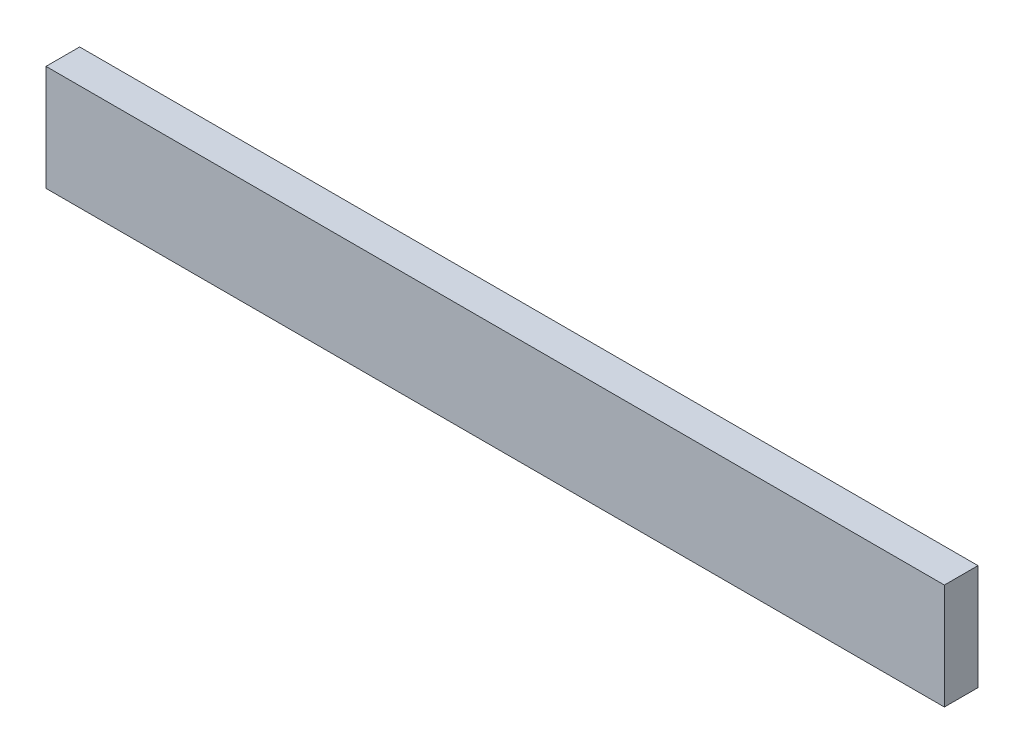
ISO-10303-21;
HEADER;
FILE_DESCRIPTION(('STEP AP214'),'2;1');
FILE_NAME('part.step','',(''),(''),'','','');
FILE_SCHEMA(('AUTOMOTIVE_DESIGN { 1 0 10303 214 1 1 1 1 }'));
ENDSEC;
DATA;
#1=APPLICATION_CONTEXT('core data for automotive mechanical design processes');
#2=APPLICATION_PROTOCOL_DEFINITION('international standard','automotive_design',2000,#1);
#3=PRODUCT_CONTEXT('',#1,'mechanical');
#4=PRODUCT('Part','Part','',(#3));
#5=PRODUCT_RELATED_PRODUCT_CATEGORY('part','',(#4));
#6=PRODUCT_DEFINITION_FORMATION('','',#4);
#7=PRODUCT_DEFINITION_CONTEXT('part definition',#1,'design');
#8=PRODUCT_DEFINITION('design','',#6,#7);
#9=PRODUCT_DEFINITION_SHAPE('','',#8);
#10=(LENGTH_UNIT() NAMED_UNIT(*) SI_UNIT(.MILLI.,.METRE.));
#11=(NAMED_UNIT(*) PLANE_ANGLE_UNIT() SI_UNIT($,.RADIAN.));
#12=(NAMED_UNIT(*) SI_UNIT($,.STERADIAN.) SOLID_ANGLE_UNIT());
#13=UNCERTAINTY_MEASURE_WITH_UNIT(LENGTH_MEASURE(1.E-05),#10,'distance_accuracy_value','');
#14=(GEOMETRIC_REPRESENTATION_CONTEXT(3) GLOBAL_UNCERTAINTY_ASSIGNED_CONTEXT((#13)) GLOBAL_UNIT_ASSIGNED_CONTEXT((#10,
#11,#12)) REPRESENTATION_CONTEXT('',''));
#15=CARTESIAN_POINT('',(0.,0.,0.));
#16=DIRECTION('',(0.,0.,1.));
#17=DIRECTION('',(1.,0.,0.));
#18=AXIS2_PLACEMENT_3D('',#15,#16,#17);
#19=CARTESIAN_POINT('',(-46.1032052955488,20.4143430228172,1.75));
#20=DIRECTION('',(1.,0.,0.));
#21=DIRECTION('',(0.,0.,-1.));
#22=AXIS2_PLACEMENT_3D('',#19,#20,#21);
#23=PLANE('',#22);
#24=DIRECTION('',(0.,-1.,0.));
#25=VECTOR('',#24,1.);
#26=CARTESIAN_POINT('',(-46.1032052955488,20.4143430228172,0.));
#27=LINE('',#26,#25);
#28=CARTESIAN_POINT('',(-46.1032052955488,20.4143430228172,0.));
#29=VERTEX_POINT('',#28);
#30=CARTESIAN_POINT('',(-46.1032052955488,14.9143430228172,0.));
#31=VERTEX_POINT('',#30);
#32=EDGE_CURVE('E96',#29,#31,#27,.T.);
#33=ORIENTED_EDGE('',*,*,#32,.T.);
#34=DIRECTION('',(0.,0.,-1.));
#35=VECTOR('',#34,1.);
#36=CARTESIAN_POINT('',(-46.1032052955488,14.9143430228172,1.75));
#37=LINE('',#36,#35);
#38=CARTESIAN_POINT('',(-46.1032052955488,14.9143430228172,1.75));
#39=VERTEX_POINT('',#38);
#40=EDGE_CURVE('E11',#39,#31,#37,.T.);
#41=ORIENTED_EDGE('',*,*,#40,.F.);
#42=DIRECTION('',(0.,-1.,0.));
#43=VECTOR('',#42,1.);
#44=CARTESIAN_POINT('',(-46.1032052955488,20.4143430228172,1.75));
#45=LINE('',#44,#43);
#46=CARTESIAN_POINT('',(-46.1032052955488,20.4143430228172,1.75));
#47=VERTEX_POINT('',#46);
#48=EDGE_CURVE('E84',#47,#39,#45,.T.);
#49=ORIENTED_EDGE('',*,*,#48,.F.);
#50=DIRECTION('',(0.,0.,-1.));
#51=VECTOR('',#50,1.);
#52=CARTESIAN_POINT('',(-46.1032052955488,20.4143430228172,1.75));
#53=LINE('',#52,#51);
#54=EDGE_CURVE('E92',#47,#29,#53,.T.);
#55=ORIENTED_EDGE('',*,*,#54,.T.);
#56=EDGE_LOOP('',(#33,#41,#49,#55));
#57=FACE_BOUND('',#56,.T.);
#58=ADVANCED_FACE('F33',(#57),#23,.F.);
#59=CARTESIAN_POINT('',(-46.1032052955488,14.9143430228172,1.75));
#60=DIRECTION('',(0.,1.,0.));
#61=DIRECTION('',(0.,0.,1.));
#62=AXIS2_PLACEMENT_3D('',#59,#60,#61);
#63=PLANE('',#62);
#64=DIRECTION('',(1.,0.,0.));
#65=VECTOR('',#64,1.);
#66=CARTESIAN_POINT('',(-46.1032052955488,14.9143430228172,0.));
#67=LINE('',#66,#65);
#68=CARTESIAN_POINT('',(0.646794704451184,14.9143430228172,0.));
#69=VERTEX_POINT('',#68);
#70=EDGE_CURVE('E88',#31,#69,#67,.T.);
#71=ORIENTED_EDGE('',*,*,#70,.T.);
#72=DIRECTION('',(0.,0.,-1.));
#73=VECTOR('',#72,1.);
#74=CARTESIAN_POINT('',(0.646794704451184,14.9143430228172,1.75));
#75=LINE('',#74,#73);
#76=CARTESIAN_POINT('',(0.646794704451184,14.9143430228172,1.75));
#77=VERTEX_POINT('',#76);
#78=EDGE_CURVE('E41',#77,#69,#75,.T.);
#79=ORIENTED_EDGE('',*,*,#78,.F.);
#80=DIRECTION('',(1.,0.,0.));
#81=VECTOR('',#80,1.);
#82=CARTESIAN_POINT('',(-46.1032052955488,14.9143430228172,1.75));
#83=LINE('',#82,#81);
#84=EDGE_CURVE('E79',#39,#77,#83,.T.);
#85=ORIENTED_EDGE('',*,*,#84,.F.);
#86=ORIENTED_EDGE('',*,*,#40,.T.);
#87=EDGE_LOOP('',(#71,#79,#85,#86));
#88=FACE_BOUND('',#87,.T.);
#89=ADVANCED_FACE('F87',(#88),#63,.F.);
#90=CARTESIAN_POINT('',(0.646794704451184,20.4143430228172,1.75));
#91=DIRECTION('',(-1.,0.,0.));
#92=DIRECTION('',(0.,0.,1.));
#93=AXIS2_PLACEMENT_3D('',#90,#91,#92);
#94=PLANE('',#93);
#95=DIRECTION('',(0.,1.,0.));
#96=VECTOR('',#95,1.);
#97=CARTESIAN_POINT('',(0.646794704451184,20.4143430228172,0.));
#98=LINE('',#97,#96);
#99=CARTESIAN_POINT('',(0.646794704451184,20.4143430228172,0.));
#100=VERTEX_POINT('',#99);
#101=EDGE_CURVE('E66',#69,#100,#98,.T.);
#102=ORIENTED_EDGE('',*,*,#101,.T.);
#103=DIRECTION('',(0.,0.,-1.));
#104=VECTOR('',#103,1.);
#105=CARTESIAN_POINT('',(0.646794704451184,20.4143430228172,1.75));
#106=LINE('',#105,#104);
#107=CARTESIAN_POINT('',(0.646794704451184,20.4143430228172,1.75));
#108=VERTEX_POINT('',#107);
#109=EDGE_CURVE('E89',#108,#100,#106,.T.);
#110=ORIENTED_EDGE('',*,*,#109,.F.);
#111=DIRECTION('',(0.,1.,0.));
#112=VECTOR('',#111,1.);
#113=CARTESIAN_POINT('',(0.646794704451184,20.4143430228172,1.75));
#114=LINE('',#113,#112);
#115=EDGE_CURVE('E82',#77,#108,#114,.T.);
#116=ORIENTED_EDGE('',*,*,#115,.F.);
#117=ORIENTED_EDGE('',*,*,#78,.T.);
#118=EDGE_LOOP('',(#102,#110,#116,#117));
#119=FACE_BOUND('',#118,.T.);
#120=ADVANCED_FACE('F90',(#119),#94,.F.);
#121=CARTESIAN_POINT('',(-46.1032052955488,20.4143430228172,1.75));
#122=DIRECTION('',(0.,-1.,0.));
#123=DIRECTION('',(0.,0.,-1.));
#124=AXIS2_PLACEMENT_3D('',#121,#122,#123);
#125=PLANE('',#124);
#126=DIRECTION('',(-1.,0.,0.));
#127=VECTOR('',#126,1.);
#128=CARTESIAN_POINT('',(-46.1032052955488,20.4143430228172,0.));
#129=LINE('',#128,#127);
#130=EDGE_CURVE('E72',#100,#29,#129,.T.);
#131=ORIENTED_EDGE('',*,*,#130,.T.);
#132=ORIENTED_EDGE('',*,*,#54,.F.);
#133=DIRECTION('',(-1.,0.,0.));
#134=VECTOR('',#133,1.);
#135=CARTESIAN_POINT('',(-46.1032052955488,20.4143430228172,1.75));
#136=LINE('',#135,#134);
#137=EDGE_CURVE('E49',#108,#47,#136,.T.);
#138=ORIENTED_EDGE('',*,*,#137,.F.);
#139=ORIENTED_EDGE('',*,*,#109,.T.);
#140=EDGE_LOOP('',(#131,#132,#138,#139));
#141=FACE_BOUND('',#140,.T.);
#142=ADVANCED_FACE('F103',(#141),#125,.F.);
#143=CARTESIAN_POINT('',(0.,0.,1.75));
#144=DIRECTION('',(0.,0.,1.));
#145=DIRECTION('',(1.,0.,0.));
#146=AXIS2_PLACEMENT_3D('',#143,#144,#145);
#147=PLANE('',#146);
#148=ORIENTED_EDGE('',*,*,#48,.T.);
#149=ORIENTED_EDGE('',*,*,#84,.T.);
#150=ORIENTED_EDGE('',*,*,#115,.T.);
#151=ORIENTED_EDGE('',*,*,#137,.T.);
#152=EDGE_LOOP('',(#148,#149,#150,#151));
#153=FACE_BOUND('',#152,.T.);
#154=ADVANCED_FACE('F80',(#153),#147,.T.);
#155=CARTESIAN_POINT('',(0.,0.,0.));
#156=DIRECTION('',(0.,0.,1.));
#157=DIRECTION('',(1.,0.,0.));
#158=AXIS2_PLACEMENT_3D('',#155,#156,#157);
#159=PLANE('',#158);
#160=ORIENTED_EDGE('',*,*,#32,.F.);
#161=ORIENTED_EDGE('',*,*,#130,.F.);
#162=ORIENTED_EDGE('',*,*,#101,.F.);
#163=ORIENTED_EDGE('',*,*,#70,.F.);
#164=EDGE_LOOP('',(#160,#161,#162,#163));
#165=FACE_BOUND('',#164,.T.);
#166=ADVANCED_FACE('F106',(#165),#159,.F.);
#167=CLOSED_SHELL('',(#58,#89,#120,#142,#154,#166));
#168=MANIFOLD_SOLID_BREP('B2',#167);
#169=ADVANCED_BREP_SHAPE_REPRESENTATION('',(#18,#168),#14);
#170=SHAPE_DEFINITION_REPRESENTATION(#9,#169);
ENDSEC;
END-ISO-10303-21;
